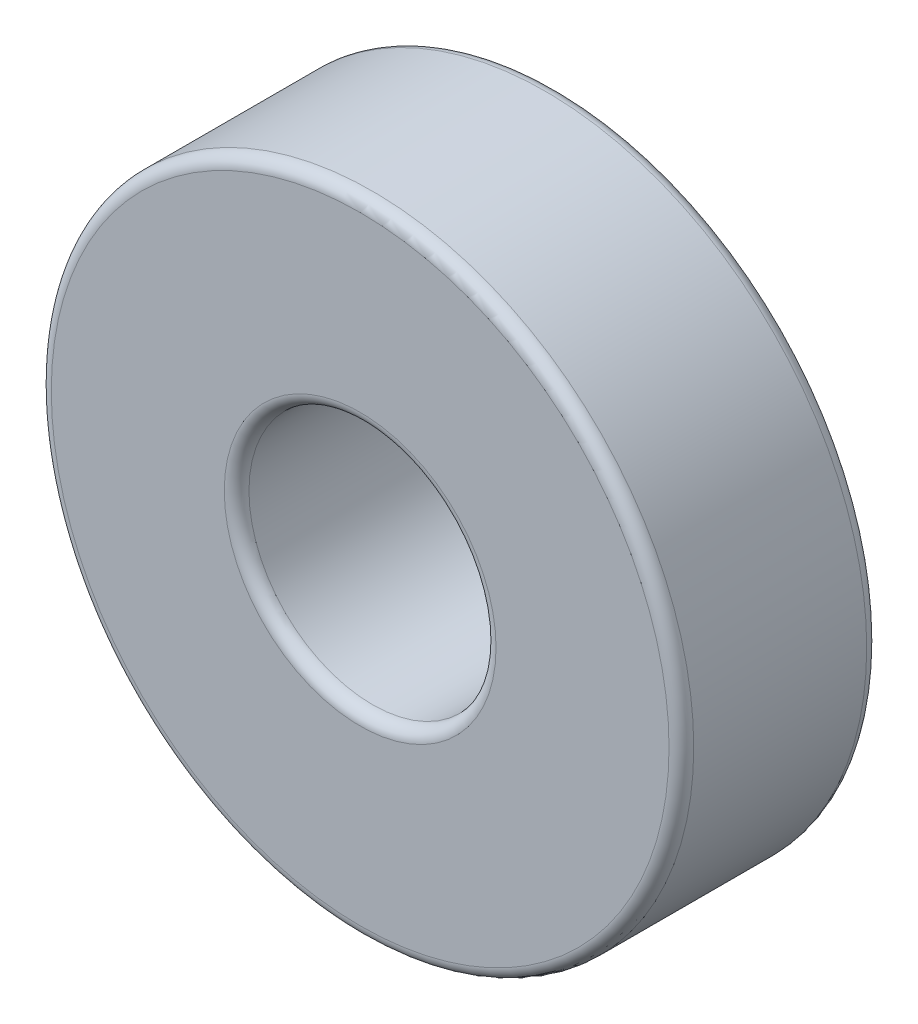
ISO-10303-21;
HEADER;
FILE_DESCRIPTION(('STEP AP214'),'2;1');
FILE_NAME('part.step','',(''),(''),'','','');
FILE_SCHEMA(('AUTOMOTIVE_DESIGN { 1 0 10303 214 1 1 1 1 }'));
ENDSEC;
DATA;
#1=APPLICATION_CONTEXT('core data for automotive mechanical design processes');
#2=APPLICATION_PROTOCOL_DEFINITION('international standard','automotive_design',2000,#1);
#3=PRODUCT_CONTEXT('',#1,'mechanical');
#4=PRODUCT('Part','Part','',(#3));
#5=PRODUCT_RELATED_PRODUCT_CATEGORY('part','',(#4));
#6=PRODUCT_DEFINITION_FORMATION('','',#4);
#7=PRODUCT_DEFINITION_CONTEXT('part definition',#1,'design');
#8=PRODUCT_DEFINITION('design','',#6,#7);
#9=PRODUCT_DEFINITION_SHAPE('','',#8);
#10=(LENGTH_UNIT() NAMED_UNIT(*) SI_UNIT(.MILLI.,.METRE.));
#11=(NAMED_UNIT(*) PLANE_ANGLE_UNIT() SI_UNIT($,.RADIAN.));
#12=(NAMED_UNIT(*) SI_UNIT($,.STERADIAN.) SOLID_ANGLE_UNIT());
#13=UNCERTAINTY_MEASURE_WITH_UNIT(LENGTH_MEASURE(1.E-05),#10,'distance_accuracy_value','');
#14=(GEOMETRIC_REPRESENTATION_CONTEXT(3) GLOBAL_UNCERTAINTY_ASSIGNED_CONTEXT((#13)) GLOBAL_UNIT_ASSIGNED_CONTEXT((#10,
#11,#12)) REPRESENTATION_CONTEXT('',''));
#15=CARTESIAN_POINT('',(0.,0.,0.));
#16=DIRECTION('',(0.,0.,1.));
#17=DIRECTION('',(1.,0.,0.));
#18=AXIS2_PLACEMENT_3D('',#15,#16,#17);
#19=CARTESIAN_POINT('',(0.,0.,8.));
#20=DIRECTION('',(0.,0.,1.));
#21=DIRECTION('',(1.,0.,0.));
#22=AXIS2_PLACEMENT_3D('',#19,#20,#21);
#23=PLANE('',#22);
#24=CARTESIAN_POINT('',(0.,0.,8.));
#25=DIRECTION('',(0.,0.,1.));
#26=DIRECTION('',(1.,0.,0.));
#27=AXIS2_PLACEMENT_3D('',#24,#25,#26);
#28=CIRCLE('',#27,5.5);
#29=CARTESIAN_POINT('',(5.5,0.,8.));
#30=VERTEX_POINT('',#29);
#31=EDGE_CURVE('E53',#30,#30,#28,.F.);
#32=ORIENTED_EDGE('',*,*,#31,.T.);
#33=EDGE_LOOP('',(#32));
#34=FACE_BOUND('',#33,.T.);
#35=CARTESIAN_POINT('',(0.,0.,8.));
#36=DIRECTION('',(0.,0.,1.));
#37=DIRECTION('',(1.,0.,0.));
#38=AXIS2_PLACEMENT_3D('',#35,#36,#37);
#39=CIRCLE('',#38,12.5);
#40=CARTESIAN_POINT('',(12.5,0.,8.));
#41=VERTEX_POINT('',#40);
#42=EDGE_CURVE('E56',#41,#41,#39,.T.);
#43=ORIENTED_EDGE('',*,*,#42,.T.);
#44=EDGE_LOOP('',(#43));
#45=FACE_BOUND('',#44,.T.);
#46=ADVANCED_FACE('F33',(#34,#45),#23,.T.);
#47=CARTESIAN_POINT('',(0.,0.,0.));
#48=DIRECTION('',(0.,0.,1.));
#49=DIRECTION('',(1.,0.,0.));
#50=AXIS2_PLACEMENT_3D('',#47,#48,#49);
#51=PLANE('',#50);
#52=CARTESIAN_POINT('',(0.,0.,0.));
#53=DIRECTION('',(0.,0.,1.));
#54=DIRECTION('',(1.,0.,0.));
#55=AXIS2_PLACEMENT_3D('',#52,#53,#54);
#56=CIRCLE('',#55,5.5);
#57=CARTESIAN_POINT('',(5.5,0.,0.));
#58=VERTEX_POINT('',#57);
#59=EDGE_CURVE('E44',#58,#58,#56,.T.);
#60=ORIENTED_EDGE('',*,*,#59,.T.);
#61=EDGE_LOOP('',(#60));
#62=FACE_BOUND('',#61,.T.);
#63=CARTESIAN_POINT('',(0.,0.,0.));
#64=DIRECTION('',(0.,0.,1.));
#65=DIRECTION('',(1.,0.,0.));
#66=AXIS2_PLACEMENT_3D('',#63,#64,#65);
#67=CIRCLE('',#66,12.5);
#68=CARTESIAN_POINT('',(12.5,0.,0.));
#69=VERTEX_POINT('',#68);
#70=EDGE_CURVE('E48',#69,#69,#67,.F.);
#71=ORIENTED_EDGE('',*,*,#70,.T.);
#72=EDGE_LOOP('',(#71));
#73=FACE_BOUND('',#72,.T.);
#74=ADVANCED_FACE('F76',(#62,#73),#51,.F.);
#75=CARTESIAN_POINT('',(0.,0.,8.));
#76=DIRECTION('',(0.,0.,-1.));
#77=DIRECTION('',(-1.,0.,0.));
#78=AXIS2_PLACEMENT_3D('',#75,#76,#77);
#79=CYLINDRICAL_SURFACE('',#78,13.);
#80=CARTESIAN_POINT('',(0.,0.,0.5));
#81=DIRECTION('',(0.,0.,1.));
#82=DIRECTION('',(1.,0.,0.));
#83=AXIS2_PLACEMENT_3D('',#80,#81,#82);
#84=CIRCLE('',#83,13.);
#85=CARTESIAN_POINT('',(13.,0.,0.5));
#86=VERTEX_POINT('',#85);
#87=EDGE_CURVE('E10',#86,#86,#84,.T.);
#88=ORIENTED_EDGE('',*,*,#87,.T.);
#89=EDGE_LOOP('',(#88));
#90=FACE_BOUND('',#89,.T.);
#91=CARTESIAN_POINT('',(0.,0.,7.5));
#92=DIRECTION('',(0.,0.,1.));
#93=DIRECTION('',(1.,0.,0.));
#94=AXIS2_PLACEMENT_3D('',#91,#92,#93);
#95=CIRCLE('',#94,13.);
#96=CARTESIAN_POINT('',(13.,0.,7.5));
#97=VERTEX_POINT('',#96);
#98=EDGE_CURVE('E40',#97,#97,#95,.F.);
#99=ORIENTED_EDGE('',*,*,#98,.T.);
#100=EDGE_LOOP('',(#99));
#101=FACE_BOUND('',#100,.T.);
#102=ADVANCED_FACE('F79',(#90,#101),#79,.T.);
#103=CARTESIAN_POINT('',(0.,0.,8.));
#104=DIRECTION('',(0.,0.,-1.));
#105=DIRECTION('',(-1.,0.,0.));
#106=AXIS2_PLACEMENT_3D('',#103,#104,#105);
#107=CYLINDRICAL_SURFACE('',#106,5.);
#108=CARTESIAN_POINT('',(0.,0.,7.5));
#109=DIRECTION('',(0.,0.,1.));
#110=DIRECTION('',(1.,0.,0.));
#111=AXIS2_PLACEMENT_3D('',#108,#109,#110);
#112=CIRCLE('',#111,5.);
#113=CARTESIAN_POINT('',(5.,0.,7.5));
#114=VERTEX_POINT('',#113);
#115=EDGE_CURVE('E59',#114,#114,#112,.T.);
#116=ORIENTED_EDGE('',*,*,#115,.T.);
#117=EDGE_LOOP('',(#116));
#118=FACE_BOUND('',#117,.T.);
#119=CARTESIAN_POINT('',(0.,0.,0.5));
#120=DIRECTION('',(0.,0.,1.));
#121=DIRECTION('',(1.,0.,0.));
#122=AXIS2_PLACEMENT_3D('',#119,#120,#121);
#123=CIRCLE('',#122,5.);
#124=CARTESIAN_POINT('',(5.,0.,0.5));
#125=VERTEX_POINT('',#124);
#126=EDGE_CURVE('E62',#125,#125,#123,.F.);
#127=ORIENTED_EDGE('',*,*,#126,.T.);
#128=EDGE_LOOP('',(#127));
#129=FACE_BOUND('',#128,.T.);
#130=ADVANCED_FACE('F66',(#118,#129),#107,.F.);
#131=CARTESIAN_POINT('',(0.,0.,7.5));
#132=DIRECTION('',(0.,0.,1.));
#133=DIRECTION('',(1.,0.,0.));
#134=AXIS2_PLACEMENT_3D('',#131,#132,#133);
#135=TOROIDAL_SURFACE('',#134,5.5,0.5);
#136=ORIENTED_EDGE('',*,*,#31,.F.);
#137=EDGE_LOOP('',(#136));
#138=FACE_BOUND('',#137,.T.);
#139=ORIENTED_EDGE('',*,*,#115,.F.);
#140=EDGE_LOOP('',(#139));
#141=FACE_BOUND('',#140,.T.);
#142=ADVANCED_FACE('F72',(#138,#141),#135,.T.);
#143=CARTESIAN_POINT('',(0.,0.,0.5));
#144=DIRECTION('',(0.,0.,1.));
#145=DIRECTION('',(1.,0.,0.));
#146=AXIS2_PLACEMENT_3D('',#143,#144,#145);
#147=TOROIDAL_SURFACE('',#146,5.5,0.5);
#148=ORIENTED_EDGE('',*,*,#126,.F.);
#149=EDGE_LOOP('',(#148));
#150=FACE_BOUND('',#149,.T.);
#151=ORIENTED_EDGE('',*,*,#59,.F.);
#152=EDGE_LOOP('',(#151));
#153=FACE_BOUND('',#152,.T.);
#154=ADVANCED_FACE('F68',(#150,#153),#147,.T.);
#155=CARTESIAN_POINT('',(0.,0.,0.5));
#156=DIRECTION('',(0.,0.,1.));
#157=DIRECTION('',(1.,0.,0.));
#158=AXIS2_PLACEMENT_3D('',#155,#156,#157);
#159=TOROIDAL_SURFACE('',#158,12.5,0.5);
#160=ORIENTED_EDGE('',*,*,#70,.F.);
#161=EDGE_LOOP('',(#160));
#162=FACE_BOUND('',#161,.T.);
#163=ORIENTED_EDGE('',*,*,#87,.F.);
#164=EDGE_LOOP('',(#163));
#165=FACE_BOUND('',#164,.T.);
#166=ADVANCED_FACE('F71',(#162,#165),#159,.T.);
#167=CARTESIAN_POINT('',(0.,0.,7.5));
#168=DIRECTION('',(0.,0.,1.));
#169=DIRECTION('',(1.,0.,0.));
#170=AXIS2_PLACEMENT_3D('',#167,#168,#169);
#171=TOROIDAL_SURFACE('',#170,12.5,0.5);
#172=ORIENTED_EDGE('',*,*,#98,.F.);
#173=EDGE_LOOP('',(#172));
#174=FACE_BOUND('',#173,.T.);
#175=ORIENTED_EDGE('',*,*,#42,.F.);
#176=EDGE_LOOP('',(#175));
#177=FACE_BOUND('',#176,.T.);
#178=ADVANCED_FACE('F35',(#174,#177),#171,.T.);
#179=CLOSED_SHELL('',(#46,#74,#102,#130,#142,#154,#166,#178));
#180=MANIFOLD_SOLID_BREP('B2',#179);
#181=ADVANCED_BREP_SHAPE_REPRESENTATION('',(#18,#180),#14);
#182=SHAPE_DEFINITION_REPRESENTATION(#9,#181);
ENDSEC;
END-ISO-10303-21;
